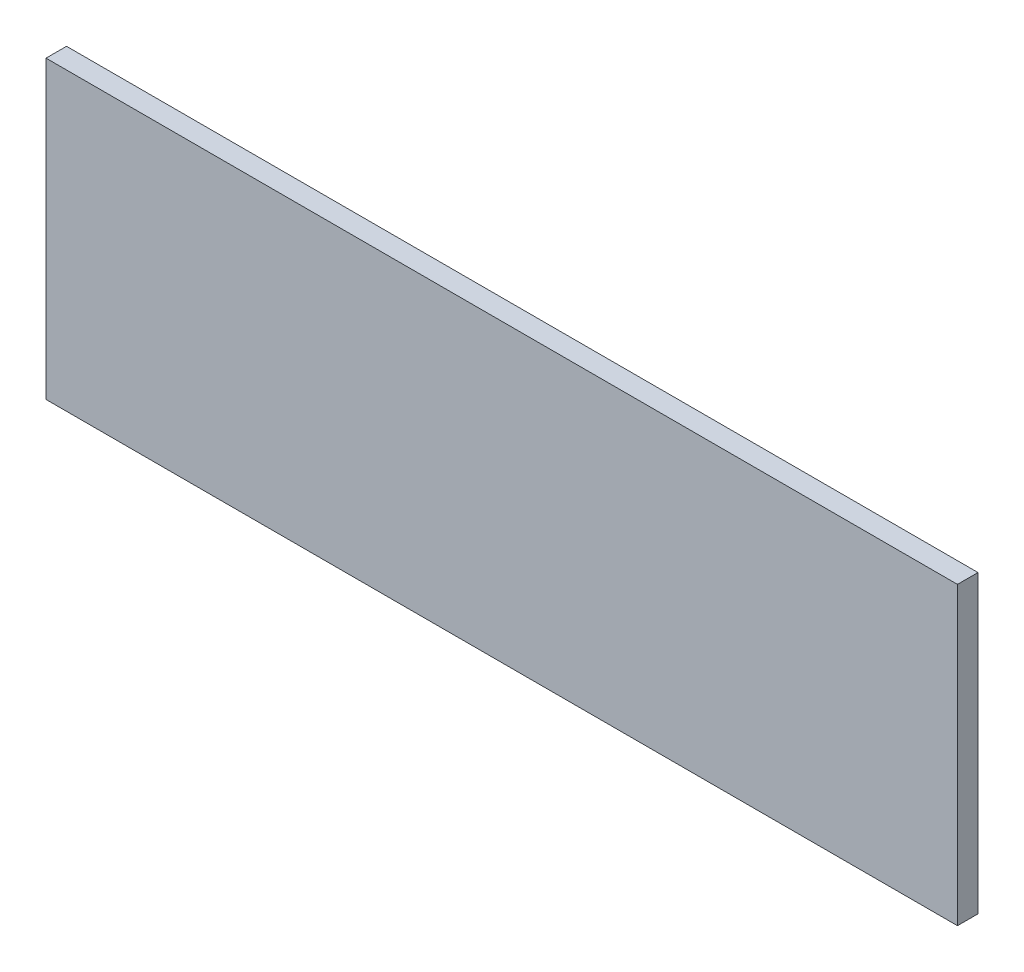
ISO-10303-21;
HEADER;
FILE_DESCRIPTION(('STEP AP214'),'2;1');
FILE_NAME('part.step','',(''),(''),'','','');
FILE_SCHEMA(('AUTOMOTIVE_DESIGN { 1 0 10303 214 1 1 1 1 }'));
ENDSEC;
DATA;
#1=APPLICATION_CONTEXT('core data for automotive mechanical design processes');
#2=APPLICATION_PROTOCOL_DEFINITION('international standard','automotive_design',2000,#1);
#3=PRODUCT_CONTEXT('',#1,'mechanical');
#4=PRODUCT('Part','Part','',(#3));
#5=PRODUCT_RELATED_PRODUCT_CATEGORY('part','',(#4));
#6=PRODUCT_DEFINITION_FORMATION('','',#4);
#7=PRODUCT_DEFINITION_CONTEXT('part definition',#1,'design');
#8=PRODUCT_DEFINITION('design','',#6,#7);
#9=PRODUCT_DEFINITION_SHAPE('','',#8);
#10=(LENGTH_UNIT() NAMED_UNIT(*) SI_UNIT(.MILLI.,.METRE.));
#11=(NAMED_UNIT(*) PLANE_ANGLE_UNIT() SI_UNIT($,.RADIAN.));
#12=(NAMED_UNIT(*) SI_UNIT($,.STERADIAN.) SOLID_ANGLE_UNIT());
#13=UNCERTAINTY_MEASURE_WITH_UNIT(LENGTH_MEASURE(1.E-05),#10,'distance_accuracy_value','');
#14=(GEOMETRIC_REPRESENTATION_CONTEXT(3) GLOBAL_UNCERTAINTY_ASSIGNED_CONTEXT((#13)) GLOBAL_UNIT_ASSIGNED_CONTEXT((#10,
#11,#12)) REPRESENTATION_CONTEXT('',''));
#15=CARTESIAN_POINT('',(0.,0.,0.));
#16=DIRECTION('',(0.,0.,1.));
#17=DIRECTION('',(1.,0.,0.));
#18=AXIS2_PLACEMENT_3D('',#15,#16,#17);
#19=CARTESIAN_POINT('',(35.2425,-11.43,1.5875));
#20=DIRECTION('',(-1.,0.,0.));
#21=DIRECTION('',(0.,0.,1.));
#22=AXIS2_PLACEMENT_3D('',#19,#20,#21);
#23=PLANE('',#22);
#24=DIRECTION('',(0.,1.,0.));
#25=VECTOR('',#24,1.);
#26=CARTESIAN_POINT('',(35.2425,-11.43,0.));
#27=LINE('',#26,#25);
#28=CARTESIAN_POINT('',(35.2425,-11.43,0.));
#29=VERTEX_POINT('',#28);
#30=CARTESIAN_POINT('',(35.2425,11.43,0.));
#31=VERTEX_POINT('',#30);
#32=EDGE_CURVE('E95',#29,#31,#27,.T.);
#33=ORIENTED_EDGE('',*,*,#32,.T.);
#34=DIRECTION('',(0.,0.,-1.));
#35=VECTOR('',#34,1.);
#36=CARTESIAN_POINT('',(35.2425,11.43,1.5875));
#37=LINE('',#36,#35);
#38=CARTESIAN_POINT('',(35.2425,11.43,1.5875));
#39=VERTEX_POINT('',#38);
#40=EDGE_CURVE('E11',#39,#31,#37,.T.);
#41=ORIENTED_EDGE('',*,*,#40,.F.);
#42=DIRECTION('',(0.,1.,0.));
#43=VECTOR('',#42,1.);
#44=CARTESIAN_POINT('',(35.2425,-11.43,1.5875));
#45=LINE('',#44,#43);
#46=CARTESIAN_POINT('',(35.2425,-11.43,1.5875));
#47=VERTEX_POINT('',#46);
#48=EDGE_CURVE('E83',#47,#39,#45,.T.);
#49=ORIENTED_EDGE('',*,*,#48,.F.);
#50=DIRECTION('',(0.,0.,-1.));
#51=VECTOR('',#50,1.);
#52=CARTESIAN_POINT('',(35.2425,-11.43,1.5875));
#53=LINE('',#52,#51);
#54=EDGE_CURVE('E91',#47,#29,#53,.T.);
#55=ORIENTED_EDGE('',*,*,#54,.T.);
#56=EDGE_LOOP('',(#33,#41,#49,#55));
#57=FACE_BOUND('',#56,.T.);
#58=ADVANCED_FACE('F32',(#57),#23,.F.);
#59=CARTESIAN_POINT('',(-35.2425,11.43,1.5875));
#60=DIRECTION('',(0.,-1.,0.));
#61=DIRECTION('',(0.,0.,-1.));
#62=AXIS2_PLACEMENT_3D('',#59,#60,#61);
#63=PLANE('',#62);
#64=DIRECTION('',(-1.,0.,0.));
#65=VECTOR('',#64,1.);
#66=CARTESIAN_POINT('',(-35.2425,11.43,0.));
#67=LINE('',#66,#65);
#68=CARTESIAN_POINT('',(-35.2425,11.43,0.));
#69=VERTEX_POINT('',#68);
#70=EDGE_CURVE('E87',#31,#69,#67,.T.);
#71=ORIENTED_EDGE('',*,*,#70,.T.);
#72=DIRECTION('',(0.,0.,-1.));
#73=VECTOR('',#72,1.);
#74=CARTESIAN_POINT('',(-35.2425,11.43,1.5875));
#75=LINE('',#74,#73);
#76=CARTESIAN_POINT('',(-35.2425,11.43,1.5875));
#77=VERTEX_POINT('',#76);
#78=EDGE_CURVE('E40',#77,#69,#75,.T.);
#79=ORIENTED_EDGE('',*,*,#78,.F.);
#80=DIRECTION('',(-1.,0.,0.));
#81=VECTOR('',#80,1.);
#82=CARTESIAN_POINT('',(-35.2425,11.43,1.5875));
#83=LINE('',#82,#81);
#84=EDGE_CURVE('E78',#39,#77,#83,.T.);
#85=ORIENTED_EDGE('',*,*,#84,.F.);
#86=ORIENTED_EDGE('',*,*,#40,.T.);
#87=EDGE_LOOP('',(#71,#79,#85,#86));
#88=FACE_BOUND('',#87,.T.);
#89=ADVANCED_FACE('F86',(#88),#63,.F.);
#90=CARTESIAN_POINT('',(-35.2425,-11.43,1.5875));
#91=DIRECTION('',(1.,0.,0.));
#92=DIRECTION('',(0.,0.,-1.));
#93=AXIS2_PLACEMENT_3D('',#90,#91,#92);
#94=PLANE('',#93);
#95=DIRECTION('',(0.,-1.,0.));
#96=VECTOR('',#95,1.);
#97=CARTESIAN_POINT('',(-35.2425,-11.43,0.));
#98=LINE('',#97,#96);
#99=CARTESIAN_POINT('',(-35.2425,-11.43,0.));
#100=VERTEX_POINT('',#99);
#101=EDGE_CURVE('E65',#69,#100,#98,.T.);
#102=ORIENTED_EDGE('',*,*,#101,.T.);
#103=DIRECTION('',(0.,0.,-1.));
#104=VECTOR('',#103,1.);
#105=CARTESIAN_POINT('',(-35.2425,-11.43,1.5875));
#106=LINE('',#105,#104);
#107=CARTESIAN_POINT('',(-35.2425,-11.43,1.5875));
#108=VERTEX_POINT('',#107);
#109=EDGE_CURVE('E88',#108,#100,#106,.T.);
#110=ORIENTED_EDGE('',*,*,#109,.F.);
#111=DIRECTION('',(0.,-1.,0.));
#112=VECTOR('',#111,1.);
#113=CARTESIAN_POINT('',(-35.2425,-11.43,1.5875));
#114=LINE('',#113,#112);
#115=EDGE_CURVE('E81',#77,#108,#114,.T.);
#116=ORIENTED_EDGE('',*,*,#115,.F.);
#117=ORIENTED_EDGE('',*,*,#78,.T.);
#118=EDGE_LOOP('',(#102,#110,#116,#117));
#119=FACE_BOUND('',#118,.T.);
#120=ADVANCED_FACE('F89',(#119),#94,.F.);
#121=CARTESIAN_POINT('',(-35.2425,-11.43,1.5875));
#122=DIRECTION('',(0.,1.,0.));
#123=DIRECTION('',(0.,0.,1.));
#124=AXIS2_PLACEMENT_3D('',#121,#122,#123);
#125=PLANE('',#124);
#126=DIRECTION('',(1.,0.,0.));
#127=VECTOR('',#126,1.);
#128=CARTESIAN_POINT('',(-35.2425,-11.43,0.));
#129=LINE('',#128,#127);
#130=EDGE_CURVE('E71',#100,#29,#129,.T.);
#131=ORIENTED_EDGE('',*,*,#130,.T.);
#132=ORIENTED_EDGE('',*,*,#54,.F.);
#133=DIRECTION('',(1.,0.,0.));
#134=VECTOR('',#133,1.);
#135=CARTESIAN_POINT('',(-35.2425,-11.43,1.5875));
#136=LINE('',#135,#134);
#137=EDGE_CURVE('E48',#108,#47,#136,.T.);
#138=ORIENTED_EDGE('',*,*,#137,.F.);
#139=ORIENTED_EDGE('',*,*,#109,.T.);
#140=EDGE_LOOP('',(#131,#132,#138,#139));
#141=FACE_BOUND('',#140,.T.);
#142=ADVANCED_FACE('F102',(#141),#125,.F.);
#143=CARTESIAN_POINT('',(35.2425,11.43,1.5875));
#144=DIRECTION('',(0.,0.,-1.));
#145=DIRECTION('',(-1.,0.,0.));
#146=AXIS2_PLACEMENT_3D('',#143,#144,#145);
#147=PLANE('',#146);
#148=ORIENTED_EDGE('',*,*,#48,.T.);
#149=ORIENTED_EDGE('',*,*,#84,.T.);
#150=ORIENTED_EDGE('',*,*,#115,.T.);
#151=ORIENTED_EDGE('',*,*,#137,.T.);
#152=EDGE_LOOP('',(#148,#149,#150,#151));
#153=FACE_BOUND('',#152,.T.);
#154=ADVANCED_FACE('F79',(#153),#147,.F.);
#155=CARTESIAN_POINT('',(35.2425,11.43,0.));
#156=DIRECTION('',(0.,0.,-1.));
#157=DIRECTION('',(-1.,0.,0.));
#158=AXIS2_PLACEMENT_3D('',#155,#156,#157);
#159=PLANE('',#158);
#160=ORIENTED_EDGE('',*,*,#32,.F.);
#161=ORIENTED_EDGE('',*,*,#130,.F.);
#162=ORIENTED_EDGE('',*,*,#101,.F.);
#163=ORIENTED_EDGE('',*,*,#70,.F.);
#164=EDGE_LOOP('',(#160,#161,#162,#163));
#165=FACE_BOUND('',#164,.T.);
#166=ADVANCED_FACE('F105',(#165),#159,.T.);
#167=CLOSED_SHELL('',(#58,#89,#120,#142,#154,#166));
#168=MANIFOLD_SOLID_BREP('B2',#167);
#169=ADVANCED_BREP_SHAPE_REPRESENTATION('',(#18,#168),#14);
#170=SHAPE_DEFINITION_REPRESENTATION(#9,#169);
ENDSEC;
END-ISO-10303-21;
